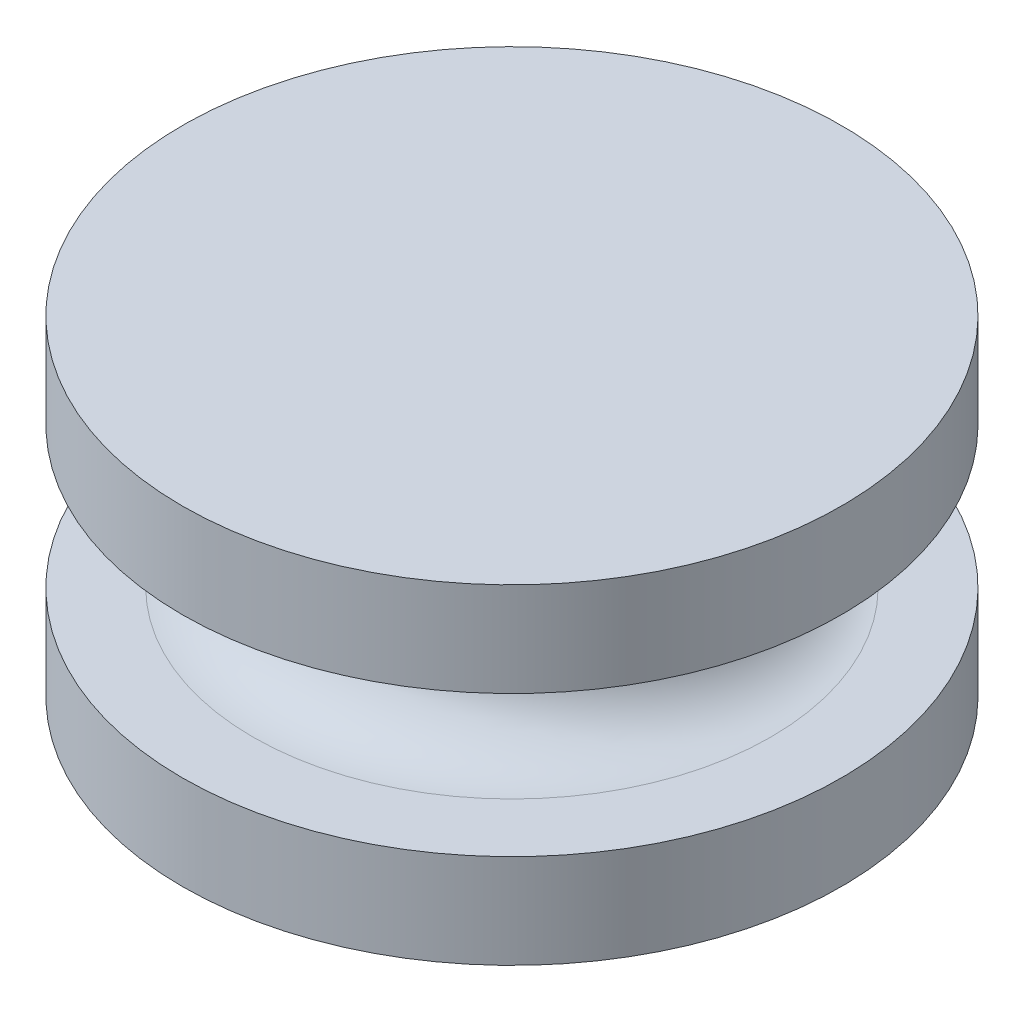
ISO-10303-21;
HEADER;
FILE_DESCRIPTION(('STEP AP214'),'2;1');
FILE_NAME('part.step','',(''),(''),'','','');
FILE_SCHEMA(('AUTOMOTIVE_DESIGN { 1 0 10303 214 1 1 1 1 }'));
ENDSEC;
DATA;
#1=APPLICATION_CONTEXT('core data for automotive mechanical design processes');
#2=APPLICATION_PROTOCOL_DEFINITION('international standard','automotive_design',2000,#1);
#3=PRODUCT_CONTEXT('',#1,'mechanical');
#4=PRODUCT('Part','Part','',(#3));
#5=PRODUCT_RELATED_PRODUCT_CATEGORY('part','',(#4));
#6=PRODUCT_DEFINITION_FORMATION('','',#4);
#7=PRODUCT_DEFINITION_CONTEXT('part definition',#1,'design');
#8=PRODUCT_DEFINITION('design','',#6,#7);
#9=PRODUCT_DEFINITION_SHAPE('','',#8);
#10=(LENGTH_UNIT() NAMED_UNIT(*) SI_UNIT(.MILLI.,.METRE.));
#11=(NAMED_UNIT(*) PLANE_ANGLE_UNIT() SI_UNIT($,.RADIAN.));
#12=(NAMED_UNIT(*) SI_UNIT($,.STERADIAN.) SOLID_ANGLE_UNIT());
#13=UNCERTAINTY_MEASURE_WITH_UNIT(LENGTH_MEASURE(1.E-05),#10,'distance_accuracy_value','');
#14=(GEOMETRIC_REPRESENTATION_CONTEXT(3) GLOBAL_UNCERTAINTY_ASSIGNED_CONTEXT((#13)) GLOBAL_UNIT_ASSIGNED_CONTEXT((#10,
#11,#12)) REPRESENTATION_CONTEXT('',''));
#15=CARTESIAN_POINT('',(0.,0.,0.));
#16=DIRECTION('',(0.,0.,1.));
#17=DIRECTION('',(1.,0.,0.));
#18=AXIS2_PLACEMENT_3D('',#15,#16,#17);
#19=CARTESIAN_POINT('',(0.,-3.5,0.));
#20=DIRECTION('',(0.,-1.,0.));
#21=DIRECTION('',(0.,0.,-1.));
#22=AXIS2_PLACEMENT_3D('',#19,#20,#21);
#23=PLANE('',#22);
#24=CARTESIAN_POINT('',(0.,-3.5,0.));
#25=DIRECTION('',(0.,1.,0.));
#26=DIRECTION('',(0.,0.,1.));
#27=AXIS2_PLACEMENT_3D('',#24,#25,#26);
#28=CIRCLE('',#27,7.);
#29=CARTESIAN_POINT('',(0.,-3.5,7.));
#30=VERTEX_POINT('',#29);
#31=EDGE_CURVE('E10',#30,#30,#28,.T.);
#32=ORIENTED_EDGE('',*,*,#31,.F.);
#33=EDGE_LOOP('',(#32));
#34=FACE_BOUND('',#33,.T.);
#35=ADVANCED_FACE('F33',(#34),#23,.T.);
#36=CARTESIAN_POINT('',(0.,3.5,0.));
#37=DIRECTION('',(0.,1.,0.));
#38=DIRECTION('',(0.,0.,1.));
#39=AXIS2_PLACEMENT_3D('',#36,#37,#38);
#40=CYLINDRICAL_SURFACE('',#39,7.);
#41=ORIENTED_EDGE('',*,*,#31,.T.);
#42=EDGE_LOOP('',(#41));
#43=FACE_BOUND('',#42,.T.);
#44=CARTESIAN_POINT('',(0.,-1.5,0.));
#45=DIRECTION('',(0.,1.,0.));
#46=DIRECTION('',(0.,0.,1.));
#47=AXIS2_PLACEMENT_3D('',#44,#45,#46);
#48=CIRCLE('',#47,7.);
#49=CARTESIAN_POINT('',(0.,-1.5,7.));
#50=VERTEX_POINT('',#49);
#51=EDGE_CURVE('E39',#50,#50,#48,.T.);
#52=ORIENTED_EDGE('',*,*,#51,.F.);
#53=EDGE_LOOP('',(#52));
#54=FACE_BOUND('',#53,.T.);
#55=ADVANCED_FACE('F75',(#43,#54),#40,.T.);
#56=CARTESIAN_POINT('',(-7.,-1.5,0.));
#57=DIRECTION('',(0.,1.,0.));
#58=DIRECTION('',(0.,0.,1.));
#59=AXIS2_PLACEMENT_3D('',#56,#57,#58);
#60=PLANE('',#59);
#61=ORIENTED_EDGE('',*,*,#51,.T.);
#62=EDGE_LOOP('',(#61));
#63=FACE_BOUND('',#62,.T.);
#64=CARTESIAN_POINT('',(0.,-1.5,0.));
#65=DIRECTION('',(0.,1.,0.));
#66=DIRECTION('',(0.,0.,1.));
#67=AXIS2_PLACEMENT_3D('',#64,#65,#66);
#68=CIRCLE('',#67,5.5);
#69=CARTESIAN_POINT('',(0.,-1.5,5.5));
#70=VERTEX_POINT('',#69);
#71=EDGE_CURVE('E43',#70,#70,#68,.T.);
#72=ORIENTED_EDGE('',*,*,#71,.F.);
#73=EDGE_LOOP('',(#72));
#74=FACE_BOUND('',#73,.T.);
#75=ADVANCED_FACE('F80',(#63,#74),#60,.T.);
#76=CARTESIAN_POINT('',(0.,0.,0.));
#77=DIRECTION('',(0.,1.,0.));
#78=DIRECTION('',(0.,0.,1.));
#79=AXIS2_PLACEMENT_3D('',#76,#77,#78);
#80=TOROIDAL_SURFACE('',#79,5.5,1.5);
#81=ORIENTED_EDGE('',*,*,#71,.T.);
#82=EDGE_LOOP('',(#81));
#83=FACE_BOUND('',#82,.T.);
#84=CARTESIAN_POINT('',(0.,1.5,0.));
#85=DIRECTION('',(0.,1.,0.));
#86=DIRECTION('',(0.,0.,1.));
#87=AXIS2_PLACEMENT_3D('',#84,#85,#86);
#88=CIRCLE('',#87,5.5);
#89=CARTESIAN_POINT('',(0.,1.5,5.5));
#90=VERTEX_POINT('',#89);
#91=EDGE_CURVE('E47',#90,#90,#88,.T.);
#92=ORIENTED_EDGE('',*,*,#91,.F.);
#93=EDGE_LOOP('',(#92));
#94=FACE_BOUND('',#93,.T.);
#95=ADVANCED_FACE('F71',(#83,#94),#80,.F.);
#96=CARTESIAN_POINT('',(-7.,1.5,0.));
#97=DIRECTION('',(0.,-1.,0.));
#98=DIRECTION('',(0.,0.,-1.));
#99=AXIS2_PLACEMENT_3D('',#96,#97,#98);
#100=PLANE('',#99);
#101=ORIENTED_EDGE('',*,*,#91,.T.);
#102=EDGE_LOOP('',(#101));
#103=FACE_BOUND('',#102,.T.);
#104=CARTESIAN_POINT('',(0.,1.5,0.));
#105=DIRECTION('',(0.,1.,0.));
#106=DIRECTION('',(0.,0.,1.));
#107=AXIS2_PLACEMENT_3D('',#104,#105,#106);
#108=CIRCLE('',#107,7.);
#109=CARTESIAN_POINT('',(0.,1.5,7.));
#110=VERTEX_POINT('',#109);
#111=EDGE_CURVE('E52',#110,#110,#108,.T.);
#112=ORIENTED_EDGE('',*,*,#111,.F.);
#113=EDGE_LOOP('',(#112));
#114=FACE_BOUND('',#113,.T.);
#115=ADVANCED_FACE('F63',(#103,#114),#100,.T.);
#116=CARTESIAN_POINT('',(0.,3.5,0.));
#117=DIRECTION('',(0.,1.,0.));
#118=DIRECTION('',(0.,0.,1.));
#119=AXIS2_PLACEMENT_3D('',#116,#117,#118);
#120=CYLINDRICAL_SURFACE('',#119,7.);
#121=ORIENTED_EDGE('',*,*,#111,.T.);
#122=EDGE_LOOP('',(#121));
#123=FACE_BOUND('',#122,.T.);
#124=CARTESIAN_POINT('',(0.,3.5,0.));
#125=DIRECTION('',(0.,1.,0.));
#126=DIRECTION('',(0.,0.,1.));
#127=AXIS2_PLACEMENT_3D('',#124,#125,#126);
#128=CIRCLE('',#127,7.);
#129=CARTESIAN_POINT('',(0.,3.5,7.));
#130=VERTEX_POINT('',#129);
#131=EDGE_CURVE('E55',#130,#130,#128,.T.);
#132=ORIENTED_EDGE('',*,*,#131,.F.);
#133=EDGE_LOOP('',(#132));
#134=FACE_BOUND('',#133,.T.);
#135=ADVANCED_FACE('F61',(#123,#134),#120,.T.);
#136=CARTESIAN_POINT('',(0.,3.5,0.));
#137=DIRECTION('',(0.,1.,0.));
#138=DIRECTION('',(0.,0.,1.));
#139=AXIS2_PLACEMENT_3D('',#136,#137,#138);
#140=PLANE('',#139);
#141=ORIENTED_EDGE('',*,*,#131,.T.);
#142=EDGE_LOOP('',(#141));
#143=FACE_BOUND('',#142,.T.);
#144=ADVANCED_FACE('F59',(#143),#140,.T.);
#145=CLOSED_SHELL('',(#35,#55,#75,#95,#115,#135,#144));
#146=MANIFOLD_SOLID_BREP('B2',#145);
#147=ADVANCED_BREP_SHAPE_REPRESENTATION('',(#18,#146),#14);
#148=SHAPE_DEFINITION_REPRESENTATION(#9,#147);
ENDSEC;
END-ISO-10303-21;
